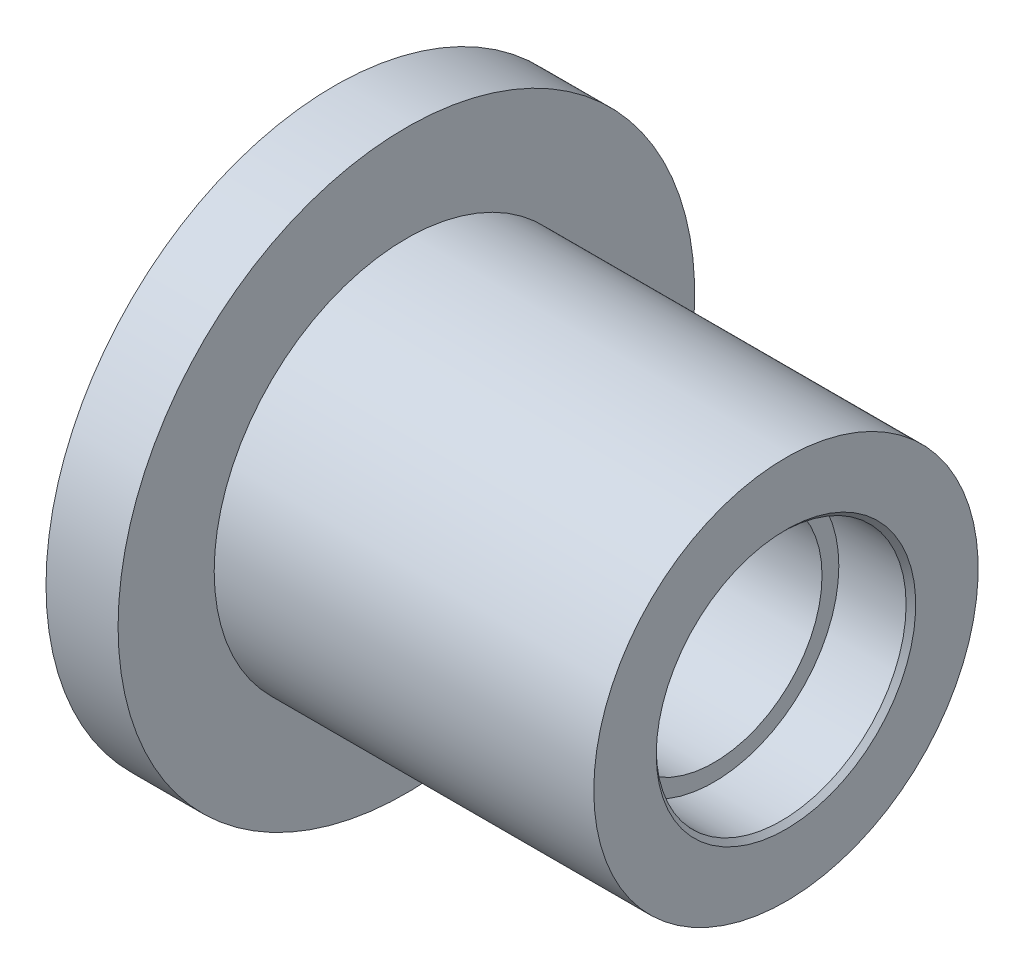
ISO-10303-21;
HEADER;
FILE_DESCRIPTION(('STEP AP214'),'2;1');
FILE_NAME('part.step','',(''),(''),'','','');
FILE_SCHEMA(('AUTOMOTIVE_DESIGN { 1 0 10303 214 1 1 1 1 }'));
ENDSEC;
DATA;
#1=APPLICATION_CONTEXT('core data for automotive mechanical design processes');
#2=APPLICATION_PROTOCOL_DEFINITION('international standard','automotive_design',2000,#1);
#3=PRODUCT_CONTEXT('',#1,'mechanical');
#4=PRODUCT('Part','Part','',(#3));
#5=PRODUCT_RELATED_PRODUCT_CATEGORY('part','',(#4));
#6=PRODUCT_DEFINITION_FORMATION('','',#4);
#7=PRODUCT_DEFINITION_CONTEXT('part definition',#1,'design');
#8=PRODUCT_DEFINITION('design','',#6,#7);
#9=PRODUCT_DEFINITION_SHAPE('','',#8);
#10=(LENGTH_UNIT() NAMED_UNIT(*) SI_UNIT(.MILLI.,.METRE.));
#11=(NAMED_UNIT(*) PLANE_ANGLE_UNIT() SI_UNIT($,.RADIAN.));
#12=(NAMED_UNIT(*) SI_UNIT($,.STERADIAN.) SOLID_ANGLE_UNIT());
#13=UNCERTAINTY_MEASURE_WITH_UNIT(LENGTH_MEASURE(1.E-05),#10,'distance_accuracy_value','');
#14=(GEOMETRIC_REPRESENTATION_CONTEXT(3) GLOBAL_UNCERTAINTY_ASSIGNED_CONTEXT((#13)) GLOBAL_UNIT_ASSIGNED_CONTEXT((#10,
#11,#12)) REPRESENTATION_CONTEXT('',''));
#15=CARTESIAN_POINT('',(0.,0.,0.));
#16=DIRECTION('',(0.,0.,1.));
#17=DIRECTION('',(1.,0.,0.));
#18=AXIS2_PLACEMENT_3D('',#15,#16,#17);
#19=CARTESIAN_POINT('',(29.,0.,0.));
#20=DIRECTION('',(-1.,0.,0.));
#21=DIRECTION('',(0.,0.,1.));
#22=AXIS2_PLACEMENT_3D('',#19,#20,#21);
#23=CYLINDRICAL_SURFACE('',#22,26.);
#24=CARTESIAN_POINT('',(0.,0.,0.));
#25=DIRECTION('',(-1.,0.,0.));
#26=DIRECTION('',(0.,0.,1.));
#27=AXIS2_PLACEMENT_3D('',#24,#25,#26);
#28=CIRCLE('',#27,26.);
#29=CARTESIAN_POINT('',(0.,0.,26.));
#30=VERTEX_POINT('',#29);
#31=EDGE_CURVE('E183',#30,#30,#28,.T.);
#32=CARTESIAN_POINT('',(11.85,0.,0.));
#33=DIRECTION('',(1.,0.,0.));
#34=DIRECTION('',(0.,0.,-1.));
#35=AXIS2_PLACEMENT_3D('',#32,#33,#34);
#36=CIRCLE('',#35,26.);
#37=CARTESIAN_POINT('',(11.85,0.,26.));
#38=VERTEX_POINT('',#37);
#39=EDGE_CURVE('E48',#38,#38,#36,.F.);
#40=CARTESIAN_POINT('',(0.,0.,26.));
#41=CARTESIAN_POINT('',(0.1234375,0.,26.));
#42=CARTESIAN_POINT('',(0.246875000000001,0.,26.));
#43=CARTESIAN_POINT('',(0.493750000000001,0.,26.));
#44=CARTESIAN_POINT('',(0.617187500000001,0.,26.));
#45=CARTESIAN_POINT('',(0.864062500000001,0.,26.));
#46=CARTESIAN_POINT('',(0.9875,0.,26.));
#47=CARTESIAN_POINT('',(1.234375,0.,26.));
#48=CARTESIAN_POINT('',(1.3578125,0.,26.));
#49=CARTESIAN_POINT('',(1.6046875,0.,26.));
#50=CARTESIAN_POINT('',(1.728125,0.,26.));
#51=CARTESIAN_POINT('',(1.975,0.,26.));
#52=CARTESIAN_POINT('',(2.0984375,0.,26.));
#53=CARTESIAN_POINT('',(2.3453125,0.,26.));
#54=CARTESIAN_POINT('',(2.46875,0.,26.));
#55=CARTESIAN_POINT('',(2.715625,0.,26.));
#56=CARTESIAN_POINT('',(2.8390625,0.,26.));
#57=CARTESIAN_POINT('',(3.0859375,0.,26.));
#58=CARTESIAN_POINT('',(3.209375,0.,26.));
#59=CARTESIAN_POINT('',(3.45625,0.,26.));
#60=CARTESIAN_POINT('',(3.5796875,0.,26.));
#61=CARTESIAN_POINT('',(3.8265625,0.,26.));
#62=CARTESIAN_POINT('',(3.95,0.,26.));
#63=CARTESIAN_POINT('',(4.196875,0.,26.));
#64=CARTESIAN_POINT('',(4.3203125,0.,26.));
#65=CARTESIAN_POINT('',(4.5671875,0.,26.));
#66=CARTESIAN_POINT('',(4.690625,0.,26.));
#67=CARTESIAN_POINT('',(4.9375,0.,26.));
#68=CARTESIAN_POINT('',(5.0609375,0.,26.));
#69=CARTESIAN_POINT('',(5.3078125,0.,26.));
#70=CARTESIAN_POINT('',(5.43125,0.,26.));
#71=CARTESIAN_POINT('',(5.678125,0.,26.));
#72=CARTESIAN_POINT('',(5.8015625,0.,26.));
#73=CARTESIAN_POINT('',(6.0484375,0.,26.));
#74=CARTESIAN_POINT('',(6.171875,0.,26.));
#75=CARTESIAN_POINT('',(6.41875,0.,26.));
#76=CARTESIAN_POINT('',(6.5421875,0.,26.));
#77=CARTESIAN_POINT('',(6.7890625,0.,26.));
#78=CARTESIAN_POINT('',(6.9125,0.,26.));
#79=CARTESIAN_POINT('',(7.159375,0.,26.));
#80=CARTESIAN_POINT('',(7.2828125,0.,26.));
#81=CARTESIAN_POINT('',(7.5296875,0.,26.));
#82=CARTESIAN_POINT('',(7.653125,0.,26.));
#83=CARTESIAN_POINT('',(7.9,0.,26.));
#84=CARTESIAN_POINT('',(8.0234375,0.,26.));
#85=CARTESIAN_POINT('',(8.2703125,0.,26.));
#86=CARTESIAN_POINT('',(8.39375,0.,26.));
#87=CARTESIAN_POINT('',(8.640625,0.,26.));
#88=CARTESIAN_POINT('',(8.7640625,0.,26.));
#89=CARTESIAN_POINT('',(9.0109375,0.,26.));
#90=CARTESIAN_POINT('',(9.134375,0.,26.));
#91=CARTESIAN_POINT('',(9.38125,0.,26.));
#92=CARTESIAN_POINT('',(9.5046875,0.,26.));
#93=CARTESIAN_POINT('',(9.7515625,0.,26.));
#94=CARTESIAN_POINT('',(9.875,0.,26.));
#95=CARTESIAN_POINT('',(10.121875,0.,26.));
#96=CARTESIAN_POINT('',(10.2453125,0.,26.));
#97=CARTESIAN_POINT('',(10.4921875,0.,26.));
#98=CARTESIAN_POINT('',(10.615625,0.,26.));
#99=CARTESIAN_POINT('',(10.8625,0.,26.));
#100=CARTESIAN_POINT('',(10.9859375,0.,26.));
#101=CARTESIAN_POINT('',(11.2328125,0.,26.));
#102=CARTESIAN_POINT('',(11.35625,0.,26.));
#103=CARTESIAN_POINT('',(11.603125,0.,26.));
#104=CARTESIAN_POINT('',(11.7265625,0.,26.));
#105=CARTESIAN_POINT('',(11.85,0.,26.));
#106=B_SPLINE_CURVE_WITH_KNOTS('',3,(#40,#41,#42,#43,#44,#45,#46,#47,#48,#49,#50,#51,#52,#53,
#54,#55,#56,#57,#58,#59,#60,#61,#62,#63,#64,#65,#66,#67,#68,#69,#70,#71,#72,#73,#74,#75,#76,#77,
#78,#79,#80,#81,#82,#83,#84,#85,#86,#87,#88,#89,#90,#91,#92,#93,#94,#95,#96,#97,#98,#99,#100,
#101,#102,#103,#104,#105),.UNSPECIFIED.,.F.,.F.,(4,2,2,2,2,2,2,2,2,2,2,2,2,2,2,2,2,2,2,2,2,2,2,
2,2,2,2,2,2,2,2,2,4),(0.,0.370312500000001,0.740625000000002,1.1109375,1.48125,1.8515625,
2.221875,2.5921875,2.9625,3.3328125,3.703125,4.0734375,4.44375,4.8140625,5.184375,5.5546875,
5.925,6.2953125,6.665625,7.0359375,7.40625,7.7765625,8.146875,8.5171875,8.8875,9.2578125,
9.628125,9.9984375,10.36875,10.7390625,11.109375,11.4796875,11.85),.UNSPECIFIED.);
#107=EDGE_CURVE('BSEAM43',#30,#38,#106,.T.);
#108=ORIENTED_EDGE('',*,*,#31,.T.);
#109=ORIENTED_EDGE('',*,*,#39,.F.);
#110=ORIENTED_EDGE('',*,*,#107,.T.);
#111=ORIENTED_EDGE('',*,*,#107,.F.);
#112=EDGE_LOOP('',(#108,#110,#109,#111));
#113=FACE_BOUND('',#112,.T.);
#114=ADVANCED_FACE('F43',(#113),#23,.F.);
#115=CARTESIAN_POINT('',(29.,0.,0.));
#116=DIRECTION('',(-1.,0.,0.));
#117=DIRECTION('',(0.,0.,1.));
#118=AXIS2_PLACEMENT_3D('',#115,#116,#117);
#119=CIRCLE('',#118,26.);
#120=CARTESIAN_POINT('',(29.,0.,26.));
#121=VERTEX_POINT('',#120);
#122=EDGE_CURVE('E173',#121,#121,#119,.T.);
#123=CARTESIAN_POINT('',(14.,0.,0.));
#124=DIRECTION('',(-1.,0.,0.));
#125=DIRECTION('',(0.,0.,1.));
#126=AXIS2_PLACEMENT_3D('',#123,#124,#125);
#127=CIRCLE('',#126,26.);
#128=CARTESIAN_POINT('',(14.,0.,26.));
#129=VERTEX_POINT('',#128);
#130=EDGE_CURVE('E174',#129,#129,#127,.F.);
#131=CARTESIAN_POINT('',(29.,0.,26.));
#132=CARTESIAN_POINT('',(28.84375,0.,26.));
#133=CARTESIAN_POINT('',(28.6875,0.,26.));
#134=CARTESIAN_POINT('',(28.375,0.,26.));
#135=CARTESIAN_POINT('',(28.21875,0.,26.));
#136=CARTESIAN_POINT('',(27.90625,0.,26.));
#137=CARTESIAN_POINT('',(27.75,0.,26.));
#138=CARTESIAN_POINT('',(27.4375,0.,26.));
#139=CARTESIAN_POINT('',(27.28125,0.,26.));
#140=CARTESIAN_POINT('',(26.96875,0.,26.));
#141=CARTESIAN_POINT('',(26.8125,0.,26.));
#142=CARTESIAN_POINT('',(26.5,0.,26.));
#143=CARTESIAN_POINT('',(26.34375,0.,26.));
#144=CARTESIAN_POINT('',(26.03125,0.,26.));
#145=CARTESIAN_POINT('',(25.875,0.,26.));
#146=CARTESIAN_POINT('',(25.5625,0.,26.));
#147=CARTESIAN_POINT('',(25.40625,0.,26.));
#148=CARTESIAN_POINT('',(25.09375,0.,26.));
#149=CARTESIAN_POINT('',(24.9375,0.,26.));
#150=CARTESIAN_POINT('',(24.625,0.,26.));
#151=CARTESIAN_POINT('',(24.46875,0.,26.));
#152=CARTESIAN_POINT('',(24.15625,0.,26.));
#153=CARTESIAN_POINT('',(24.,0.,26.));
#154=CARTESIAN_POINT('',(23.6875,0.,26.));
#155=CARTESIAN_POINT('',(23.53125,0.,26.));
#156=CARTESIAN_POINT('',(23.21875,0.,26.));
#157=CARTESIAN_POINT('',(23.0625,0.,26.));
#158=CARTESIAN_POINT('',(22.75,0.,26.));
#159=CARTESIAN_POINT('',(22.59375,0.,26.));
#160=CARTESIAN_POINT('',(22.28125,0.,26.));
#161=CARTESIAN_POINT('',(22.125,0.,26.));
#162=CARTESIAN_POINT('',(21.8125,0.,26.));
#163=CARTESIAN_POINT('',(21.65625,0.,26.));
#164=CARTESIAN_POINT('',(21.34375,0.,26.));
#165=CARTESIAN_POINT('',(21.1875,0.,26.));
#166=CARTESIAN_POINT('',(20.875,0.,26.));
#167=CARTESIAN_POINT('',(20.71875,0.,26.));
#168=CARTESIAN_POINT('',(20.40625,0.,26.));
#169=CARTESIAN_POINT('',(20.25,0.,26.));
#170=CARTESIAN_POINT('',(19.9375,0.,26.));
#171=CARTESIAN_POINT('',(19.78125,0.,26.));
#172=CARTESIAN_POINT('',(19.46875,0.,26.));
#173=CARTESIAN_POINT('',(19.3125,0.,26.));
#174=CARTESIAN_POINT('',(19.,0.,26.));
#175=CARTESIAN_POINT('',(18.84375,0.,26.));
#176=CARTESIAN_POINT('',(18.53125,0.,26.));
#177=CARTESIAN_POINT('',(18.375,0.,26.));
#178=CARTESIAN_POINT('',(18.0625,0.,26.));
#179=CARTESIAN_POINT('',(17.90625,0.,26.));
#180=CARTESIAN_POINT('',(17.59375,0.,26.));
#181=CARTESIAN_POINT('',(17.4375,0.,26.));
#182=CARTESIAN_POINT('',(17.125,0.,26.));
#183=CARTESIAN_POINT('',(16.96875,0.,26.));
#184=CARTESIAN_POINT('',(16.65625,0.,26.));
#185=CARTESIAN_POINT('',(16.5,0.,26.));
#186=CARTESIAN_POINT('',(16.1875,0.,26.));
#187=CARTESIAN_POINT('',(16.03125,0.,26.));
#188=CARTESIAN_POINT('',(15.71875,0.,26.));
#189=CARTESIAN_POINT('',(15.5625,0.,26.));
#190=CARTESIAN_POINT('',(15.25,0.,26.));
#191=CARTESIAN_POINT('',(15.09375,0.,26.));
#192=CARTESIAN_POINT('',(14.78125,0.,26.));
#193=CARTESIAN_POINT('',(14.625,0.,26.));
#194=CARTESIAN_POINT('',(14.3125,0.,26.));
#195=CARTESIAN_POINT('',(14.15625,0.,26.));
#196=CARTESIAN_POINT('',(14.,0.,26.));
#197=B_SPLINE_CURVE_WITH_KNOTS('',3,(#131,#132,#133,#134,#135,#136,#137,#138,#139,#140,#141,
#142,#143,#144,#145,#146,#147,#148,#149,#150,#151,#152,#153,#154,#155,#156,#157,#158,#159,#160,
#161,#162,#163,#164,#165,#166,#167,#168,#169,#170,#171,#172,#173,#174,#175,#176,#177,#178,#179,
#180,#181,#182,#183,#184,#185,#186,#187,#188,#189,#190,#191,#192,#193,#194,#195,#196),
.UNSPECIFIED.,.F.,.F.,(4,2,2,2,2,2,2,2,2,2,2,2,2,2,2,2,2,2,2,2,2,2,2,2,2,2,2,2,2,2,2,2,4),(0.,
0.46875,0.937500000000001,1.40625,1.875,2.34375,2.8125,3.28125,3.75,4.21875,4.6875,5.15625,
5.625,6.09375,6.5625,7.03125,7.5,7.96875,8.4375,8.90625,9.375,9.84375000000001,10.3125,10.78125,
11.25,11.71875,12.1875,12.65625,13.125,13.59375,14.0625,14.53125,15.),.UNSPECIFIED.);
#198=EDGE_CURVE('BSEAM218',#121,#129,#197,.T.);
#199=ORIENTED_EDGE('',*,*,#122,.F.);
#200=ORIENTED_EDGE('',*,*,#130,.F.);
#201=ORIENTED_EDGE('',*,*,#198,.T.);
#202=ORIENTED_EDGE('',*,*,#198,.F.);
#203=EDGE_LOOP('',(#199,#201,#200,#202));
#204=FACE_BOUND('',#203,.T.);
#205=ADVANCED_FACE('F218',(#204),#23,.F.);
#206=CARTESIAN_POINT('',(100.,0.,0.));
#207=DIRECTION('',(1.,0.,0.));
#208=DIRECTION('',(0.,0.,-1.));
#209=AXIS2_PLACEMENT_3D('',#206,#207,#208);
#210=CYLINDRICAL_SURFACE('',#209,22.5);
#211=CARTESIAN_POINT('',(85.,0.,0.));
#212=DIRECTION('',(1.,0.,0.));
#213=DIRECTION('',(0.,0.,-1.));
#214=AXIS2_PLACEMENT_3D('',#211,#212,#213);
#215=CIRCLE('',#214,22.5);
#216=CARTESIAN_POINT('',(85.,0.,-22.5));
#217=VERTEX_POINT('',#216);
#218=EDGE_CURVE('E113',#217,#217,#215,.T.);
#219=ORIENTED_EDGE('',*,*,#218,.T.);
#220=EDGE_LOOP('',(#219));
#221=FACE_BOUND('',#220,.T.);
#222=CARTESIAN_POINT('',(29.,0.,0.));
#223=DIRECTION('',(-1.,0.,0.));
#224=DIRECTION('',(0.,0.,1.));
#225=AXIS2_PLACEMENT_3D('',#222,#223,#224);
#226=CIRCLE('',#225,22.5);
#227=CARTESIAN_POINT('',(29.,0.,22.5));
#228=VERTEX_POINT('',#227);
#229=EDGE_CURVE('E170',#228,#228,#226,.F.);
#230=ORIENTED_EDGE('',*,*,#229,.F.);
#231=EDGE_LOOP('',(#230));
#232=FACE_BOUND('',#231,.T.);
#233=ADVANCED_FACE('F223',(#221,#232),#210,.F.);
#234=CARTESIAN_POINT('',(0.,0.,0.));
#235=DIRECTION('',(1.,0.,0.));
#236=DIRECTION('',(0.,0.,-1.));
#237=AXIS2_PLACEMENT_3D('',#234,#235,#236);
#238=PLANE('',#237);
#239=ORIENTED_EDGE('',*,*,#31,.F.);
#240=EDGE_LOOP('',(#239));
#241=FACE_BOUND('',#240,.T.);
#242=CARTESIAN_POINT('',(0.,0.,0.));
#243=DIRECTION('',(-1.,0.,0.));
#244=DIRECTION('',(0.,0.,1.));
#245=AXIS2_PLACEMENT_3D('',#242,#243,#244);
#246=CIRCLE('',#245,40.);
#247=CARTESIAN_POINT('',(0.,0.,40.));
#248=VERTEX_POINT('',#247);
#249=EDGE_CURVE('E153',#248,#248,#246,.T.);
#250=ORIENTED_EDGE('',*,*,#249,.T.);
#251=EDGE_LOOP('',(#250));
#252=FACE_BOUND('',#251,.T.);
#253=ADVANCED_FACE('F281',(#241,#252),#238,.F.);
#254=CARTESIAN_POINT('',(0.,0.,0.));
#255=DIRECTION('',(-1.,0.,0.));
#256=DIRECTION('',(0.,0.,1.));
#257=AXIS2_PLACEMENT_3D('',#254,#255,#256);
#258=CYLINDRICAL_SURFACE('',#257,40.);
#259=ORIENTED_EDGE('',*,*,#249,.F.);
#260=EDGE_LOOP('',(#259));
#261=FACE_BOUND('',#260,.T.);
#262=CARTESIAN_POINT('',(6.,0.,0.));
#263=DIRECTION('',(-1.,0.,0.));
#264=DIRECTION('',(0.,0.,1.));
#265=AXIS2_PLACEMENT_3D('',#262,#263,#264);
#266=CIRCLE('',#265,40.);
#267=CARTESIAN_POINT('',(6.,0.,40.));
#268=VERTEX_POINT('',#267);
#269=EDGE_CURVE('E149',#268,#268,#266,.T.);
#270=ORIENTED_EDGE('',*,*,#269,.T.);
#271=EDGE_LOOP('',(#270));
#272=FACE_BOUND('',#271,.T.);
#273=ADVANCED_FACE('F379',(#261,#272),#258,.T.);
#274=CARTESIAN_POINT('',(6.,40.,0.));
#275=DIRECTION('',(1.,0.,0.));
#276=DIRECTION('',(0.,0.,-1.));
#277=AXIS2_PLACEMENT_3D('',#274,#275,#276);
#278=PLANE('',#277);
#279=ORIENTED_EDGE('',*,*,#269,.F.);
#280=EDGE_LOOP('',(#279));
#281=FACE_BOUND('',#280,.T.);
#282=CARTESIAN_POINT('',(6.,0.,0.));
#283=DIRECTION('',(-1.,0.,0.));
#284=DIRECTION('',(0.,0.,1.));
#285=AXIS2_PLACEMENT_3D('',#282,#283,#284);
#286=CIRCLE('',#285,60.);
#287=CARTESIAN_POINT('',(6.,0.,60.));
#288=VERTEX_POINT('',#287);
#289=EDGE_CURVE('E145',#288,#288,#286,.T.);
#290=ORIENTED_EDGE('',*,*,#289,.T.);
#291=EDGE_LOOP('',(#290));
#292=FACE_BOUND('',#291,.T.);
#293=ADVANCED_FACE('F370',(#281,#292),#278,.F.);
#294=CARTESIAN_POINT('',(0.,0.,0.));
#295=DIRECTION('',(-1.,0.,0.));
#296=DIRECTION('',(0.,0.,1.));
#297=AXIS2_PLACEMENT_3D('',#294,#295,#296);
#298=CYLINDRICAL_SURFACE('',#297,60.);
#299=ORIENTED_EDGE('',*,*,#289,.F.);
#300=EDGE_LOOP('',(#299));
#301=FACE_BOUND('',#300,.T.);
#302=CARTESIAN_POINT('',(21.,0.,0.));
#303=DIRECTION('',(-1.,0.,0.));
#304=DIRECTION('',(0.,0.,1.));
#305=AXIS2_PLACEMENT_3D('',#302,#303,#304);
#306=CIRCLE('',#305,60.);
#307=CARTESIAN_POINT('',(21.,0.,60.));
#308=VERTEX_POINT('',#307);
#309=EDGE_CURVE('E141',#308,#308,#306,.T.);
#310=ORIENTED_EDGE('',*,*,#309,.T.);
#311=EDGE_LOOP('',(#310));
#312=FACE_BOUND('',#311,.T.);
#313=ADVANCED_FACE('F361',(#301,#312),#298,.T.);
#314=CARTESIAN_POINT('',(21.,60.,0.));
#315=DIRECTION('',(-1.,0.,0.));
#316=DIRECTION('',(0.,0.,1.));
#317=AXIS2_PLACEMENT_3D('',#314,#315,#316);
#318=PLANE('',#317);
#319=ORIENTED_EDGE('',*,*,#309,.F.);
#320=EDGE_LOOP('',(#319));
#321=FACE_BOUND('',#320,.T.);
#322=CARTESIAN_POINT('',(21.,0.,0.));
#323=DIRECTION('',(-1.,0.,0.));
#324=DIRECTION('',(0.,0.,1.));
#325=AXIS2_PLACEMENT_3D('',#322,#323,#324);
#326=CIRCLE('',#325,40.);
#327=CARTESIAN_POINT('',(21.,0.,40.));
#328=VERTEX_POINT('',#327);
#329=EDGE_CURVE('E137',#328,#328,#326,.T.);
#330=ORIENTED_EDGE('',*,*,#329,.T.);
#331=EDGE_LOOP('',(#330));
#332=FACE_BOUND('',#331,.T.);
#333=ADVANCED_FACE('F352',(#321,#332),#318,.F.);
#334=CARTESIAN_POINT('',(0.,0.,0.));
#335=DIRECTION('',(-1.,0.,0.));
#336=DIRECTION('',(0.,0.,1.));
#337=AXIS2_PLACEMENT_3D('',#334,#335,#336);
#338=CYLINDRICAL_SURFACE('',#337,40.);
#339=CARTESIAN_POINT('',(70.,0.,0.));
#340=DIRECTION('',(1.,0.,0.));
#341=DIRECTION('',(0.,0.,-1.));
#342=AXIS2_PLACEMENT_3D('',#339,#340,#341);
#343=CIRCLE('',#342,40.);
#344=CARTESIAN_POINT('',(70.,-12.49,-37.9999986842105));
#345=VERTEX_POINT('',#344);
#346=CARTESIAN_POINT('',(70.,12.49,-37.9999986842105));
#347=VERTEX_POINT('',#346);
#348=EDGE_CURVE('E157',#345,#347,#343,.T.);
#349=ORIENTED_EDGE('',*,*,#348,.T.);
#350=DIRECTION('',(-1.,0.,0.));
#351=VECTOR('',#350,1.);
#352=CARTESIAN_POINT('',(0.,12.49,-37.9999986842105));
#353=LINE('',#352,#351);
#354=CARTESIAN_POINT('',(50.,12.49,-37.9999986842105));
#355=VERTEX_POINT('',#354);
#356=EDGE_CURVE('E164',#347,#355,#353,.T.);
#357=ORIENTED_EDGE('',*,*,#356,.T.);
#358=CARTESIAN_POINT('',(50.,0.,0.));
#359=DIRECTION('',(-1.,0.,0.));
#360=DIRECTION('',(0.,0.,1.));
#361=AXIS2_PLACEMENT_3D('',#358,#359,#360);
#362=CIRCLE('',#361,40.);
#363=CARTESIAN_POINT('',(50.,-12.49,-37.9999986842105));
#364=VERTEX_POINT('',#363);
#365=EDGE_CURVE('E62',#355,#364,#362,.T.);
#366=ORIENTED_EDGE('',*,*,#365,.T.);
#367=DIRECTION('',(-1.,0.,0.));
#368=VECTOR('',#367,1.);
#369=CARTESIAN_POINT('',(0.,-12.49,-37.9999986842105));
#370=LINE('',#369,#368);
#371=EDGE_CURVE('E70',#364,#345,#370,.F.);
#372=ORIENTED_EDGE('',*,*,#371,.T.);
#373=EDGE_LOOP('',(#349,#357,#366,#372));
#374=FACE_BOUND('',#373,.T.);
#375=ORIENTED_EDGE('',*,*,#329,.F.);
#376=EDGE_LOOP('',(#375));
#377=FACE_BOUND('',#376,.T.);
#378=CARTESIAN_POINT('',(100.,0.,0.));
#379=DIRECTION('',(-1.,0.,0.));
#380=DIRECTION('',(0.,0.,1.));
#381=AXIS2_PLACEMENT_3D('',#378,#379,#380);
#382=CIRCLE('',#381,40.);
#383=CARTESIAN_POINT('',(100.,0.,40.));
#384=VERTEX_POINT('',#383);
#385=EDGE_CURVE('E128',#384,#384,#382,.T.);
#386=ORIENTED_EDGE('',*,*,#385,.T.);
#387=EDGE_LOOP('',(#386));
#388=FACE_BOUND('',#387,.T.);
#389=ADVANCED_FACE('F344',(#374,#377,#388),#338,.T.);
#390=CARTESIAN_POINT('',(100.,40.,0.));
#391=DIRECTION('',(-1.,0.,0.));
#392=DIRECTION('',(0.,0.,1.));
#393=AXIS2_PLACEMENT_3D('',#390,#391,#392);
#394=PLANE('',#393);
#395=CARTESIAN_POINT('',(100.,0.,0.));
#396=DIRECTION('',(-1.,0.,0.));
#397=DIRECTION('',(0.,0.,1.));
#398=AXIS2_PLACEMENT_3D('',#395,#396,#397);
#399=CIRCLE('',#398,27.);
#400=CARTESIAN_POINT('',(100.,0.,27.));
#401=VERTEX_POINT('',#400);
#402=EDGE_CURVE('E11',#401,#401,#399,.T.);
#403=ORIENTED_EDGE('',*,*,#402,.T.);
#404=EDGE_LOOP('',(#403));
#405=FACE_BOUND('',#404,.T.);
#406=ORIENTED_EDGE('',*,*,#385,.F.);
#407=EDGE_LOOP('',(#406));
#408=FACE_BOUND('',#407,.T.);
#409=ADVANCED_FACE('F336',(#405,#408),#394,.F.);
#410=CARTESIAN_POINT('',(50.,12.49,-37.));
#411=DIRECTION('',(-1.,0.,0.));
#412=DIRECTION('',(0.,0.,1.));
#413=AXIS2_PLACEMENT_3D('',#410,#411,#412);
#414=PLANE('',#413);
#415=DIRECTION('',(0.,0.,-1.));
#416=VECTOR('',#415,1.);
#417=CARTESIAN_POINT('',(50.,12.49,-37.));
#418=LINE('',#417,#416);
#419=CARTESIAN_POINT('',(50.,12.49,-37.));
#420=VERTEX_POINT('',#419);
#421=EDGE_CURVE('E87',#420,#355,#418,.T.);
#422=ORIENTED_EDGE('',*,*,#421,.F.);
#423=DIRECTION('',(0.,1.,0.));
#424=VECTOR('',#423,1.);
#425=CARTESIAN_POINT('',(50.,12.49,-37.));
#426=LINE('',#425,#424);
#427=CARTESIAN_POINT('',(50.,-12.49,-37.));
#428=VERTEX_POINT('',#427);
#429=EDGE_CURVE('E91',#428,#420,#426,.T.);
#430=ORIENTED_EDGE('',*,*,#429,.F.);
#431=DIRECTION('',(0.,0.,-1.));
#432=VECTOR('',#431,1.);
#433=CARTESIAN_POINT('',(50.,-12.49,-37.));
#434=LINE('',#433,#432);
#435=EDGE_CURVE('E125',#428,#364,#434,.T.);
#436=ORIENTED_EDGE('',*,*,#435,.T.);
#437=ORIENTED_EDGE('',*,*,#365,.F.);
#438=EDGE_LOOP('',(#422,#430,#436,#437));
#439=FACE_BOUND('',#438,.T.);
#440=ADVANCED_FACE('F89',(#439),#414,.F.);
#441=CARTESIAN_POINT('',(70.,-12.49,-37.));
#442=DIRECTION('',(0.,-1.,0.));
#443=DIRECTION('',(0.,0.,-1.));
#444=AXIS2_PLACEMENT_3D('',#441,#442,#443);
#445=PLANE('',#444);
#446=ORIENTED_EDGE('',*,*,#435,.F.);
#447=DIRECTION('',(-1.,0.,0.));
#448=VECTOR('',#447,1.);
#449=CARTESIAN_POINT('',(70.,-12.49,-37.));
#450=LINE('',#449,#448);
#451=CARTESIAN_POINT('',(70.,-12.49,-37.));
#452=VERTEX_POINT('',#451);
#453=EDGE_CURVE('E98',#452,#428,#450,.T.);
#454=ORIENTED_EDGE('',*,*,#453,.F.);
#455=DIRECTION('',(0.,0.,-1.));
#456=VECTOR('',#455,1.);
#457=CARTESIAN_POINT('',(70.,-12.49,-37.));
#458=LINE('',#457,#456);
#459=EDGE_CURVE('E129',#452,#345,#458,.T.);
#460=ORIENTED_EDGE('',*,*,#459,.T.);
#461=ORIENTED_EDGE('',*,*,#371,.F.);
#462=EDGE_LOOP('',(#446,#454,#460,#461));
#463=FACE_BOUND('',#462,.T.);
#464=ADVANCED_FACE('F320',(#463),#445,.F.);
#465=CARTESIAN_POINT('',(70.,12.49,-37.));
#466=DIRECTION('',(1.,0.,0.));
#467=DIRECTION('',(0.,0.,-1.));
#468=AXIS2_PLACEMENT_3D('',#465,#466,#467);
#469=PLANE('',#468);
#470=ORIENTED_EDGE('',*,*,#348,.F.);
#471=ORIENTED_EDGE('',*,*,#459,.F.);
#472=DIRECTION('',(0.,-1.,0.));
#473=VECTOR('',#472,1.);
#474=CARTESIAN_POINT('',(70.,12.49,-37.));
#475=LINE('',#474,#473);
#476=CARTESIAN_POINT('',(70.,12.49,-37.));
#477=VERTEX_POINT('',#476);
#478=EDGE_CURVE('E108',#477,#452,#475,.T.);
#479=ORIENTED_EDGE('',*,*,#478,.F.);
#480=DIRECTION('',(0.,0.,-1.));
#481=VECTOR('',#480,1.);
#482=CARTESIAN_POINT('',(70.,12.49,-37.));
#483=LINE('',#482,#481);
#484=EDGE_CURVE('E97',#477,#347,#483,.T.);
#485=ORIENTED_EDGE('',*,*,#484,.T.);
#486=EDGE_LOOP('',(#470,#471,#479,#485));
#487=FACE_BOUND('',#486,.T.);
#488=ADVANCED_FACE('F312',(#487),#469,.F.);
#489=CARTESIAN_POINT('',(70.,12.49,-37.));
#490=DIRECTION('',(0.,1.,0.));
#491=DIRECTION('',(0.,0.,1.));
#492=AXIS2_PLACEMENT_3D('',#489,#490,#491);
#493=PLANE('',#492);
#494=ORIENTED_EDGE('',*,*,#484,.F.);
#495=DIRECTION('',(1.,0.,0.));
#496=VECTOR('',#495,1.);
#497=CARTESIAN_POINT('',(70.,12.49,-37.));
#498=LINE('',#497,#496);
#499=EDGE_CURVE('E101',#420,#477,#498,.T.);
#500=ORIENTED_EDGE('',*,*,#499,.F.);
#501=ORIENTED_EDGE('',*,*,#421,.T.);
#502=ORIENTED_EDGE('',*,*,#356,.F.);
#503=EDGE_LOOP('',(#494,#500,#501,#502));
#504=FACE_BOUND('',#503,.T.);
#505=ADVANCED_FACE('F102',(#504),#493,.F.);
#506=CARTESIAN_POINT('',(0.,0.,-37.));
#507=DIRECTION('',(0.,0.,-1.));
#508=DIRECTION('',(-1.,0.,0.));
#509=AXIS2_PLACEMENT_3D('',#506,#507,#508);
#510=PLANE('',#509);
#511=ORIENTED_EDGE('',*,*,#429,.T.);
#512=ORIENTED_EDGE('',*,*,#499,.T.);
#513=ORIENTED_EDGE('',*,*,#478,.T.);
#514=ORIENTED_EDGE('',*,*,#453,.T.);
#515=EDGE_LOOP('',(#511,#512,#513,#514));
#516=FACE_BOUND('',#515,.T.);
#517=ADVANCED_FACE('F110',(#516),#510,.T.);
#518=CARTESIAN_POINT('',(85.,22.5,0.));
#519=DIRECTION('',(-1.,0.,0.));
#520=DIRECTION('',(0.,0.,1.));
#521=AXIS2_PLACEMENT_3D('',#518,#519,#520);
#522=PLANE('',#521);
#523=ORIENTED_EDGE('',*,*,#218,.F.);
#524=EDGE_LOOP('',(#523));
#525=FACE_BOUND('',#524,.T.);
#526=CARTESIAN_POINT('',(85.,0.,0.));
#527=DIRECTION('',(1.,0.,0.));
#528=DIRECTION('',(0.,0.,-1.));
#529=AXIS2_PLACEMENT_3D('',#526,#527,#528);
#530=CIRCLE('',#529,26.);
#531=CARTESIAN_POINT('',(85.,0.,-26.));
#532=VERTEX_POINT('',#531);
#533=EDGE_CURVE('E117',#532,#532,#530,.T.);
#534=ORIENTED_EDGE('',*,*,#533,.T.);
#535=EDGE_LOOP('',(#534));
#536=FACE_BOUND('',#535,.T.);
#537=ADVANCED_FACE('F202',(#525,#536),#522,.F.);
#538=CARTESIAN_POINT('',(100.,0.,0.));
#539=DIRECTION('',(1.,0.,0.));
#540=DIRECTION('',(0.,0.,-1.));
#541=AXIS2_PLACEMENT_3D('',#538,#539,#540);
#542=CYLINDRICAL_SURFACE('',#541,26.);
#543=CARTESIAN_POINT('',(98.9999999999999,0.,0.));
#544=DIRECTION('',(-1.,0.,0.));
#545=DIRECTION('',(0.,0.,1.));
#546=AXIS2_PLACEMENT_3D('',#543,#544,#545);
#547=CIRCLE('',#546,26.);
#548=CARTESIAN_POINT('',(98.9999999999999,0.,26.));
#549=VERTEX_POINT('',#548);
#550=EDGE_CURVE('E54',#549,#549,#547,.F.);
#551=ORIENTED_EDGE('',*,*,#550,.T.);
#552=EDGE_LOOP('',(#551));
#553=FACE_BOUND('',#552,.T.);
#554=ORIENTED_EDGE('',*,*,#533,.F.);
#555=EDGE_LOOP('',(#554));
#556=FACE_BOUND('',#555,.T.);
#557=ADVANCED_FACE('F204',(#553,#556),#542,.F.);
#558=CARTESIAN_POINT('',(98.9999999999999,0.,0.));
#559=DIRECTION('',(1.,0.,0.));
#560=DIRECTION('',(0.,0.,-1.));
#561=AXIS2_PLACEMENT_3D('',#558,#559,#560);
#562=CONICAL_SURFACE('',#561,26.,0.785398163397433);
#563=ORIENTED_EDGE('',*,*,#402,.F.);
#564=EDGE_LOOP('',(#563));
#565=FACE_BOUND('',#564,.T.);
#566=ORIENTED_EDGE('',*,*,#550,.F.);
#567=EDGE_LOOP('',(#566));
#568=FACE_BOUND('',#567,.T.);
#569=ADVANCED_FACE('F46',(#565,#568),#562,.F.);
#570=CARTESIAN_POINT('',(29.,0.,0.));
#571=DIRECTION('',(-1.,0.,0.));
#572=DIRECTION('',(0.,0.,1.));
#573=AXIS2_PLACEMENT_3D('',#570,#571,#572);
#574=PLANE('',#573);
#575=ORIENTED_EDGE('',*,*,#122,.T.);
#576=EDGE_LOOP('',(#575));
#577=FACE_BOUND('',#576,.T.);
#578=ORIENTED_EDGE('',*,*,#229,.T.);
#579=EDGE_LOOP('',(#578));
#580=FACE_BOUND('',#579,.T.);
#581=ADVANCED_FACE('F212',(#577,#580),#574,.T.);
#582=CARTESIAN_POINT('',(11.85,0.,0.));
#583=DIRECTION('',(1.,0.,0.));
#584=DIRECTION('',(0.,0.,-1.));
#585=AXIS2_PLACEMENT_3D('',#582,#583,#584);
#586=PLANE('',#585);
#587=CARTESIAN_POINT('',(11.85,0.,0.));
#588=DIRECTION('',(-1.,0.,0.));
#589=DIRECTION('',(0.,0.,1.));
#590=AXIS2_PLACEMENT_3D('',#587,#588,#589);
#591=CIRCLE('',#590,27.5);
#592=CARTESIAN_POINT('',(11.85,0.,27.5));
#593=VERTEX_POINT('',#592);
#594=EDGE_CURVE('E177',#593,#593,#591,.T.);
#595=ORIENTED_EDGE('',*,*,#594,.F.);
#596=EDGE_LOOP('',(#595));
#597=FACE_BOUND('',#596,.T.);
#598=ORIENTED_EDGE('',*,*,#39,.T.);
#599=EDGE_LOOP('',(#598));
#600=FACE_BOUND('',#599,.T.);
#601=ADVANCED_FACE('F229',(#597,#600),#586,.T.);
#602=CARTESIAN_POINT('',(14.,27.5,0.));
#603=DIRECTION('',(-1.,0.,0.));
#604=DIRECTION('',(0.,0.,1.));
#605=AXIS2_PLACEMENT_3D('',#602,#603,#604);
#606=PLANE('',#605);
#607=CARTESIAN_POINT('',(14.,0.,0.));
#608=DIRECTION('',(-1.,0.,0.));
#609=DIRECTION('',(0.,0.,1.));
#610=AXIS2_PLACEMENT_3D('',#607,#608,#609);
#611=CIRCLE('',#610,27.5);
#612=CARTESIAN_POINT('',(14.,0.,27.5));
#613=VERTEX_POINT('',#612);
#614=EDGE_CURVE('E185',#613,#613,#611,.T.);
#615=ORIENTED_EDGE('',*,*,#614,.T.);
#616=EDGE_LOOP('',(#615));
#617=FACE_BOUND('',#616,.T.);
#618=ORIENTED_EDGE('',*,*,#130,.T.);
#619=EDGE_LOOP('',(#618));
#620=FACE_BOUND('',#619,.T.);
#621=ADVANCED_FACE('F233',(#617,#620),#606,.T.);
#622=CARTESIAN_POINT('',(0.,0.,0.));
#623=DIRECTION('',(-1.,0.,0.));
#624=DIRECTION('',(0.,0.,1.));
#625=AXIS2_PLACEMENT_3D('',#622,#623,#624);
#626=CYLINDRICAL_SURFACE('',#625,27.5);
#627=ORIENTED_EDGE('',*,*,#594,.T.);
#628=EDGE_LOOP('',(#627));
#629=FACE_BOUND('',#628,.T.);
#630=ORIENTED_EDGE('',*,*,#614,.F.);
#631=EDGE_LOOP('',(#630));
#632=FACE_BOUND('',#631,.T.);
#633=ADVANCED_FACE('F235',(#629,#632),#626,.F.);
#634=CLOSED_SHELL('',(#114,#205,#233,#253,#273,#293,#313,#333,#389,#409,#440,#464,#488,#505,
#517,#537,#557,#569,#581,#601,#621,#633));
#635=MANIFOLD_SOLID_BREP('B2',#634);
#636=ADVANCED_BREP_SHAPE_REPRESENTATION('',(#18,#635),#14);
#637=SHAPE_DEFINITION_REPRESENTATION(#9,#636);
ENDSEC;
END-ISO-10303-21;
